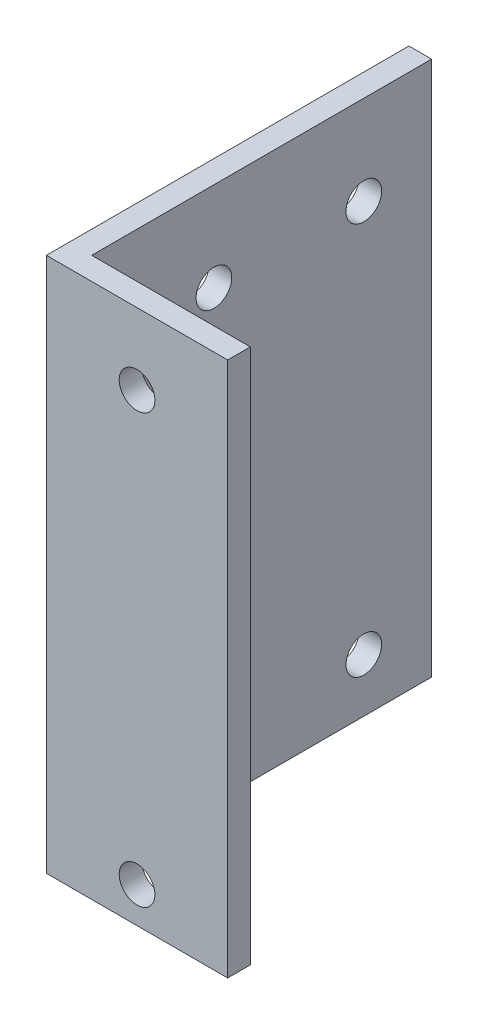
ISO-10303-21;
HEADER;
FILE_DESCRIPTION(('STEP AP214'),'2;1');
FILE_NAME('part.step','',(''),(''),'','','');
FILE_SCHEMA(('AUTOMOTIVE_DESIGN { 1 0 10303 214 1 1 1 1 }'));
ENDSEC;
DATA;
#1=APPLICATION_CONTEXT('core data for automotive mechanical design processes');
#2=APPLICATION_PROTOCOL_DEFINITION('international standard','automotive_design',2000,#1);
#3=PRODUCT_CONTEXT('',#1,'mechanical');
#4=PRODUCT('Part','Part','',(#3));
#5=PRODUCT_RELATED_PRODUCT_CATEGORY('part','',(#4));
#6=PRODUCT_DEFINITION_FORMATION('','',#4);
#7=PRODUCT_DEFINITION_CONTEXT('part definition',#1,'design');
#8=PRODUCT_DEFINITION('design','',#6,#7);
#9=PRODUCT_DEFINITION_SHAPE('','',#8);
#10=(LENGTH_UNIT() NAMED_UNIT(*) SI_UNIT(.MILLI.,.METRE.));
#11=(NAMED_UNIT(*) PLANE_ANGLE_UNIT() SI_UNIT($,.RADIAN.));
#12=(NAMED_UNIT(*) SI_UNIT($,.STERADIAN.) SOLID_ANGLE_UNIT());
#13=UNCERTAINTY_MEASURE_WITH_UNIT(LENGTH_MEASURE(1.E-05),#10,'distance_accuracy_value','');
#14=(GEOMETRIC_REPRESENTATION_CONTEXT(3) GLOBAL_UNCERTAINTY_ASSIGNED_CONTEXT((#13)) GLOBAL_UNIT_ASSIGNED_CONTEXT((#10,
#11,#12)) REPRESENTATION_CONTEXT('',''));
#15=CARTESIAN_POINT('',(0.,0.,0.));
#16=DIRECTION('',(0.,0.,1.));
#17=DIRECTION('',(1.,0.,0.));
#18=AXIS2_PLACEMENT_3D('',#15,#16,#17);
#19=CARTESIAN_POINT('',(25.4,80.,-3.175));
#20=DIRECTION('',(-1.,0.,0.));
#21=DIRECTION('',(0.,0.,1.));
#22=AXIS2_PLACEMENT_3D('',#19,#20,#21);
#23=PLANE('',#22);
#24=DIRECTION('',(0.,-1.,0.));
#25=VECTOR('',#24,1.);
#26=CARTESIAN_POINT('',(25.4,80.,0.));
#27=LINE('',#26,#25);
#28=CARTESIAN_POINT('',(25.4,80.,0.));
#29=VERTEX_POINT('',#28);
#30=CARTESIAN_POINT('',(25.4,5.,0.));
#31=VERTEX_POINT('',#30);
#32=EDGE_CURVE('E113',#29,#31,#27,.T.);
#33=ORIENTED_EDGE('',*,*,#32,.T.);
#34=DIRECTION('',(0.,0.,-1.));
#35=VECTOR('',#34,1.);
#36=CARTESIAN_POINT('',(25.4,5.,-3.175));
#37=LINE('',#36,#35);
#38=CARTESIAN_POINT('',(25.4,5.,-3.175));
#39=VERTEX_POINT('',#38);
#40=EDGE_CURVE('E56',#31,#39,#37,.T.);
#41=ORIENTED_EDGE('',*,*,#40,.T.);
#42=DIRECTION('',(0.,-1.,0.));
#43=VECTOR('',#42,1.);
#44=CARTESIAN_POINT('',(25.4,80.,-3.175));
#45=LINE('',#44,#43);
#46=CARTESIAN_POINT('',(25.4,80.,-3.175));
#47=VERTEX_POINT('',#46);
#48=EDGE_CURVE('E11',#47,#39,#45,.T.);
#49=ORIENTED_EDGE('',*,*,#48,.F.);
#50=DIRECTION('',(0.,0.,-1.));
#51=VECTOR('',#50,1.);
#52=CARTESIAN_POINT('',(25.4,80.,-3.175));
#53=LINE('',#52,#51);
#54=EDGE_CURVE('E175',#29,#47,#53,.T.);
#55=ORIENTED_EDGE('',*,*,#54,.F.);
#56=EDGE_LOOP('',(#33,#41,#49,#55));
#57=FACE_BOUND('',#56,.T.);
#58=ADVANCED_FACE('F42',(#57),#23,.F.);
#59=CARTESIAN_POINT('',(3.175,80.,-3.175));
#60=DIRECTION('',(0.,0.,1.));
#61=DIRECTION('',(1.,0.,0.));
#62=AXIS2_PLACEMENT_3D('',#59,#60,#61);
#63=PLANE('',#62);
#64=CARTESIAN_POINT('',(12.7,70.,-3.175));
#65=DIRECTION('',(0.,0.,1.));
#66=DIRECTION('',(1.,0.,0.));
#67=AXIS2_PLACEMENT_3D('',#64,#65,#66);
#68=CIRCLE('',#67,2.5);
#69=CARTESIAN_POINT('',(15.2,70.,-3.175));
#70=VERTEX_POINT('',#69);
#71=EDGE_CURVE('E148',#70,#70,#68,.T.);
#72=ORIENTED_EDGE('',*,*,#71,.T.);
#73=EDGE_LOOP('',(#72));
#74=FACE_BOUND('',#73,.T.);
#75=CARTESIAN_POINT('',(12.7,9.99999999999999,-3.175));
#76=DIRECTION('',(0.,0.,1.));
#77=DIRECTION('',(1.,0.,0.));
#78=AXIS2_PLACEMENT_3D('',#75,#76,#77);
#79=CIRCLE('',#78,2.5);
#80=CARTESIAN_POINT('',(15.2,9.99999999999999,-3.175));
#81=VERTEX_POINT('',#80);
#82=EDGE_CURVE('E143',#81,#81,#79,.T.);
#83=ORIENTED_EDGE('',*,*,#82,.T.);
#84=EDGE_LOOP('',(#83));
#85=FACE_BOUND('',#84,.T.);
#86=ORIENTED_EDGE('',*,*,#48,.T.);
#87=DIRECTION('',(-1.,0.,0.));
#88=VECTOR('',#87,1.);
#89=CARTESIAN_POINT('',(3.175,5.,-3.175));
#90=LINE('',#89,#88);
#91=CARTESIAN_POINT('',(3.175,5.,-3.175));
#92=VERTEX_POINT('',#91);
#93=EDGE_CURVE('E133',#39,#92,#90,.T.);
#94=ORIENTED_EDGE('',*,*,#93,.T.);
#95=DIRECTION('',(0.,-1.,0.));
#96=VECTOR('',#95,1.);
#97=CARTESIAN_POINT('',(3.175,80.,-3.175));
#98=LINE('',#97,#96);
#99=CARTESIAN_POINT('',(3.175,80.,-3.175));
#100=VERTEX_POINT('',#99);
#101=EDGE_CURVE('E49',#100,#92,#98,.T.);
#102=ORIENTED_EDGE('',*,*,#101,.F.);
#103=DIRECTION('',(-1.,0.,0.));
#104=VECTOR('',#103,1.);
#105=CARTESIAN_POINT('',(3.175,80.,-3.175));
#106=LINE('',#105,#104);
#107=EDGE_CURVE('E132',#47,#100,#106,.T.);
#108=ORIENTED_EDGE('',*,*,#107,.F.);
#109=EDGE_LOOP('',(#86,#94,#102,#108));
#110=FACE_BOUND('',#109,.T.);
#111=ADVANCED_FACE('F131',(#74,#85,#110),#63,.F.);
#112=CARTESIAN_POINT('',(3.175,80.,-50.8));
#113=DIRECTION('',(-1.,0.,0.));
#114=DIRECTION('',(0.,0.,1.));
#115=AXIS2_PLACEMENT_3D('',#112,#113,#114);
#116=PLANE('',#115);
#117=CARTESIAN_POINT('',(3.175,12.5,-41.3));
#118=DIRECTION('',(-1.,0.,0.));
#119=DIRECTION('',(0.,0.,1.));
#120=AXIS2_PLACEMENT_3D('',#117,#118,#119);
#121=CIRCLE('',#120,2.5);
#122=CARTESIAN_POINT('',(3.175,12.5,-38.8));
#123=VERTEX_POINT('',#122);
#124=EDGE_CURVE('E172',#123,#123,#121,.T.);
#125=ORIENTED_EDGE('',*,*,#124,.T.);
#126=EDGE_LOOP('',(#125));
#127=FACE_BOUND('',#126,.T.);
#128=CARTESIAN_POINT('',(3.175,12.5,-20.3));
#129=DIRECTION('',(-1.,0.,0.));
#130=DIRECTION('',(0.,0.,1.));
#131=AXIS2_PLACEMENT_3D('',#128,#129,#130);
#132=CIRCLE('',#131,2.5);
#133=CARTESIAN_POINT('',(3.175,12.5,-17.8));
#134=VERTEX_POINT('',#133);
#135=EDGE_CURVE('E169',#134,#134,#132,.T.);
#136=ORIENTED_EDGE('',*,*,#135,.T.);
#137=EDGE_LOOP('',(#136));
#138=FACE_BOUND('',#137,.T.);
#139=CARTESIAN_POINT('',(3.175,67.5,-20.3));
#140=DIRECTION('',(-1.,0.,0.));
#141=DIRECTION('',(0.,0.,1.));
#142=AXIS2_PLACEMENT_3D('',#139,#140,#141);
#143=CIRCLE('',#142,2.5);
#144=CARTESIAN_POINT('',(3.175,67.5,-17.8));
#145=VERTEX_POINT('',#144);
#146=EDGE_CURVE('E166',#145,#145,#143,.T.);
#147=ORIENTED_EDGE('',*,*,#146,.T.);
#148=EDGE_LOOP('',(#147));
#149=FACE_BOUND('',#148,.T.);
#150=CARTESIAN_POINT('',(3.175,67.5,-41.3));
#151=DIRECTION('',(-1.,0.,0.));
#152=DIRECTION('',(0.,0.,1.));
#153=AXIS2_PLACEMENT_3D('',#150,#151,#152);
#154=CIRCLE('',#153,2.5);
#155=CARTESIAN_POINT('',(3.175,67.5,-38.8));
#156=VERTEX_POINT('',#155);
#157=EDGE_CURVE('E163',#156,#156,#154,.T.);
#158=ORIENTED_EDGE('',*,*,#157,.T.);
#159=EDGE_LOOP('',(#158));
#160=FACE_BOUND('',#159,.T.);
#161=ORIENTED_EDGE('',*,*,#101,.T.);
#162=DIRECTION('',(0.,0.,-1.));
#163=VECTOR('',#162,1.);
#164=CARTESIAN_POINT('',(3.175,5.,-50.8));
#165=LINE('',#164,#163);
#166=CARTESIAN_POINT('',(3.175,5.,-50.8));
#167=VERTEX_POINT('',#166);
#168=EDGE_CURVE('E110',#92,#167,#165,.T.);
#169=ORIENTED_EDGE('',*,*,#168,.T.);
#170=DIRECTION('',(0.,-1.,0.));
#171=VECTOR('',#170,1.);
#172=CARTESIAN_POINT('',(3.175,80.,-50.8));
#173=LINE('',#172,#171);
#174=CARTESIAN_POINT('',(3.175,80.,-50.8));
#175=VERTEX_POINT('',#174);
#176=EDGE_CURVE('E115',#175,#167,#173,.T.);
#177=ORIENTED_EDGE('',*,*,#176,.F.);
#178=DIRECTION('',(0.,0.,-1.));
#179=VECTOR('',#178,1.);
#180=CARTESIAN_POINT('',(3.175,80.,-50.8));
#181=LINE('',#180,#179);
#182=EDGE_CURVE('E128',#100,#175,#181,.T.);
#183=ORIENTED_EDGE('',*,*,#182,.F.);
#184=EDGE_LOOP('',(#161,#169,#177,#183));
#185=FACE_BOUND('',#184,.T.);
#186=ADVANCED_FACE('F126',(#127,#138,#149,#160,#185),#116,.F.);
#187=CARTESIAN_POINT('',(0.,80.,-50.8));
#188=DIRECTION('',(0.,0.,1.));
#189=DIRECTION('',(1.,0.,0.));
#190=AXIS2_PLACEMENT_3D('',#187,#188,#189);
#191=PLANE('',#190);
#192=ORIENTED_EDGE('',*,*,#176,.T.);
#193=DIRECTION('',(-1.,0.,0.));
#194=VECTOR('',#193,1.);
#195=CARTESIAN_POINT('',(-2.3,5.,-50.8));
#196=LINE('',#195,#194);
#197=CARTESIAN_POINT('',(0.,5.,-50.8));
#198=VERTEX_POINT('',#197);
#199=EDGE_CURVE('E100',#167,#198,#196,.T.);
#200=ORIENTED_EDGE('',*,*,#199,.T.);
#201=DIRECTION('',(0.,-1.,0.));
#202=VECTOR('',#201,1.);
#203=CARTESIAN_POINT('',(0.,80.,-50.8));
#204=LINE('',#203,#202);
#205=CARTESIAN_POINT('',(0.,80.,-50.8));
#206=VERTEX_POINT('',#205);
#207=EDGE_CURVE('E109',#206,#198,#204,.T.);
#208=ORIENTED_EDGE('',*,*,#207,.F.);
#209=DIRECTION('',(-1.,0.,0.));
#210=VECTOR('',#209,1.);
#211=CARTESIAN_POINT('',(0.,80.,-50.8));
#212=LINE('',#211,#210);
#213=EDGE_CURVE('E179',#175,#206,#212,.T.);
#214=ORIENTED_EDGE('',*,*,#213,.F.);
#215=EDGE_LOOP('',(#192,#200,#208,#214));
#216=FACE_BOUND('',#215,.T.);
#217=ADVANCED_FACE('F185',(#216),#191,.F.);
#218=CARTESIAN_POINT('',(0.,80.,0.));
#219=DIRECTION('',(1.,0.,0.));
#220=DIRECTION('',(0.,0.,-1.));
#221=AXIS2_PLACEMENT_3D('',#218,#219,#220);
#222=PLANE('',#221);
#223=CARTESIAN_POINT('',(0.,12.5,-41.3));
#224=DIRECTION('',(-1.,0.,0.));
#225=DIRECTION('',(0.,0.,-1.));
#226=AXIS2_PLACEMENT_3D('',#223,#224,#225);
#227=CIRCLE('',#226,2.5);
#228=CARTESIAN_POINT('',(0.,12.5,-43.8));
#229=VERTEX_POINT('',#228);
#230=EDGE_CURVE('E151',#229,#229,#227,.T.);
#231=ORIENTED_EDGE('',*,*,#230,.F.);
#232=EDGE_LOOP('',(#231));
#233=FACE_BOUND('',#232,.T.);
#234=CARTESIAN_POINT('',(0.,12.5,-20.3));
#235=DIRECTION('',(-1.,0.,0.));
#236=DIRECTION('',(0.,0.,1.));
#237=AXIS2_PLACEMENT_3D('',#234,#235,#236);
#238=CIRCLE('',#237,2.5);
#239=CARTESIAN_POINT('',(0.,12.5,-17.8));
#240=VERTEX_POINT('',#239);
#241=EDGE_CURVE('E156',#240,#240,#238,.T.);
#242=ORIENTED_EDGE('',*,*,#241,.F.);
#243=EDGE_LOOP('',(#242));
#244=FACE_BOUND('',#243,.T.);
#245=CARTESIAN_POINT('',(0.,67.5,-20.3));
#246=DIRECTION('',(-1.,0.,0.));
#247=DIRECTION('',(0.,0.,-1.));
#248=AXIS2_PLACEMENT_3D('',#245,#246,#247);
#249=CIRCLE('',#248,2.5);
#250=CARTESIAN_POINT('',(0.,67.5,-22.8));
#251=VERTEX_POINT('',#250);
#252=EDGE_CURVE('E152',#251,#251,#249,.T.);
#253=ORIENTED_EDGE('',*,*,#252,.F.);
#254=EDGE_LOOP('',(#253));
#255=FACE_BOUND('',#254,.T.);
#256=CARTESIAN_POINT('',(0.,67.5,-41.3));
#257=DIRECTION('',(-1.,0.,0.));
#258=DIRECTION('',(0.,0.,1.));
#259=AXIS2_PLACEMENT_3D('',#256,#257,#258);
#260=CIRCLE('',#259,2.5);
#261=CARTESIAN_POINT('',(0.,67.5,-38.8));
#262=VERTEX_POINT('',#261);
#263=EDGE_CURVE('E155',#262,#262,#260,.T.);
#264=ORIENTED_EDGE('',*,*,#263,.F.);
#265=EDGE_LOOP('',(#264));
#266=FACE_BOUND('',#265,.T.);
#267=ORIENTED_EDGE('',*,*,#207,.T.);
#268=DIRECTION('',(0.,0.,1.));
#269=VECTOR('',#268,1.);
#270=CARTESIAN_POINT('',(0.,5.,0.));
#271=LINE('',#270,#269);
#272=CARTESIAN_POINT('',(0.,5.,0.));
#273=VERTEX_POINT('',#272);
#274=EDGE_CURVE('E95',#198,#273,#271,.T.);
#275=ORIENTED_EDGE('',*,*,#274,.T.);
#276=DIRECTION('',(0.,-1.,0.));
#277=VECTOR('',#276,1.);
#278=CARTESIAN_POINT('',(0.,80.,0.));
#279=LINE('',#278,#277);
#280=CARTESIAN_POINT('',(0.,80.,0.));
#281=VERTEX_POINT('',#280);
#282=EDGE_CURVE('E107',#281,#273,#279,.T.);
#283=ORIENTED_EDGE('',*,*,#282,.F.);
#284=DIRECTION('',(0.,0.,1.));
#285=VECTOR('',#284,1.);
#286=CARTESIAN_POINT('',(0.,80.,0.));
#287=LINE('',#286,#285);
#288=EDGE_CURVE('E181',#206,#281,#287,.T.);
#289=ORIENTED_EDGE('',*,*,#288,.F.);
#290=EDGE_LOOP('',(#267,#275,#283,#289));
#291=FACE_BOUND('',#290,.T.);
#292=ADVANCED_FACE('F105',(#233,#244,#255,#266,#291),#222,.F.);
#293=CARTESIAN_POINT('',(25.4,80.,0.));
#294=DIRECTION('',(0.,0.,-1.));
#295=DIRECTION('',(-1.,0.,0.));
#296=AXIS2_PLACEMENT_3D('',#293,#294,#295);
#297=PLANE('',#296);
#298=CARTESIAN_POINT('',(12.7,70.,0.));
#299=DIRECTION('',(0.,0.,1.));
#300=DIRECTION('',(1.,0.,0.));
#301=AXIS2_PLACEMENT_3D('',#298,#299,#300);
#302=CIRCLE('',#301,2.5);
#303=CARTESIAN_POINT('',(15.2,70.,0.));
#304=VERTEX_POINT('',#303);
#305=EDGE_CURVE('E140',#304,#304,#302,.T.);
#306=ORIENTED_EDGE('',*,*,#305,.F.);
#307=EDGE_LOOP('',(#306));
#308=FACE_BOUND('',#307,.T.);
#309=CARTESIAN_POINT('',(12.7,9.99999999999999,0.));
#310=DIRECTION('',(0.,0.,1.));
#311=DIRECTION('',(-1.,0.,0.));
#312=AXIS2_PLACEMENT_3D('',#309,#310,#311);
#313=CIRCLE('',#312,2.5);
#314=CARTESIAN_POINT('',(10.2,9.99999999999999,0.));
#315=VERTEX_POINT('',#314);
#316=EDGE_CURVE('E136',#315,#315,#313,.T.);
#317=ORIENTED_EDGE('',*,*,#316,.F.);
#318=EDGE_LOOP('',(#317));
#319=FACE_BOUND('',#318,.T.);
#320=ORIENTED_EDGE('',*,*,#282,.T.);
#321=DIRECTION('',(-1.,0.,0.));
#322=VECTOR('',#321,1.);
#323=CARTESIAN_POINT('',(-2.3,5.,0.));
#324=LINE('',#323,#322);
#325=EDGE_CURVE('E92',#31,#273,#324,.T.);
#326=ORIENTED_EDGE('',*,*,#325,.F.);
#327=ORIENTED_EDGE('',*,*,#32,.F.);
#328=DIRECTION('',(1.,0.,0.));
#329=VECTOR('',#328,1.);
#330=CARTESIAN_POINT('',(25.4,80.,0.));
#331=LINE('',#330,#329);
#332=EDGE_CURVE('E64',#281,#29,#331,.T.);
#333=ORIENTED_EDGE('',*,*,#332,.F.);
#334=EDGE_LOOP('',(#320,#326,#327,#333));
#335=FACE_BOUND('',#334,.T.);
#336=ADVANCED_FACE('F112',(#308,#319,#335),#297,.F.);
#337=CARTESIAN_POINT('',(0.,80.,0.));
#338=DIRECTION('',(0.,-1.,0.));
#339=DIRECTION('',(0.,0.,-1.));
#340=AXIS2_PLACEMENT_3D('',#337,#338,#339);
#341=PLANE('',#340);
#342=ORIENTED_EDGE('',*,*,#54,.T.);
#343=ORIENTED_EDGE('',*,*,#107,.T.);
#344=ORIENTED_EDGE('',*,*,#182,.T.);
#345=ORIENTED_EDGE('',*,*,#213,.T.);
#346=ORIENTED_EDGE('',*,*,#288,.T.);
#347=ORIENTED_EDGE('',*,*,#332,.T.);
#348=EDGE_LOOP('',(#342,#343,#344,#345,#346,#347));
#349=FACE_BOUND('',#348,.T.);
#350=ADVANCED_FACE('F182',(#349),#341,.F.);
#351=CARTESIAN_POINT('',(25.4,67.5,-41.3));
#352=DIRECTION('',(-1.,0.,0.));
#353=DIRECTION('',(0.,0.,1.));
#354=AXIS2_PLACEMENT_3D('',#351,#352,#353);
#355=CYLINDRICAL_SURFACE('',#354,2.5);
#356=ORIENTED_EDGE('',*,*,#263,.T.);
#357=EDGE_LOOP('',(#356));
#358=FACE_BOUND('',#357,.T.);
#359=ORIENTED_EDGE('',*,*,#157,.F.);
#360=EDGE_LOOP('',(#359));
#361=FACE_BOUND('',#360,.T.);
#362=ADVANCED_FACE('F230',(#358,#361),#355,.F.);
#363=CARTESIAN_POINT('',(25.4,67.5,-20.3));
#364=DIRECTION('',(-1.,0.,0.));
#365=DIRECTION('',(0.,0.,1.));
#366=AXIS2_PLACEMENT_3D('',#363,#364,#365);
#367=CYLINDRICAL_SURFACE('',#366,2.5);
#368=ORIENTED_EDGE('',*,*,#252,.T.);
#369=EDGE_LOOP('',(#368));
#370=FACE_BOUND('',#369,.T.);
#371=ORIENTED_EDGE('',*,*,#146,.F.);
#372=EDGE_LOOP('',(#371));
#373=FACE_BOUND('',#372,.T.);
#374=ADVANCED_FACE('F227',(#370,#373),#367,.F.);
#375=CARTESIAN_POINT('',(25.4,12.5,-20.3));
#376=DIRECTION('',(-1.,0.,0.));
#377=DIRECTION('',(0.,0.,1.));
#378=AXIS2_PLACEMENT_3D('',#375,#376,#377);
#379=CYLINDRICAL_SURFACE('',#378,2.5);
#380=ORIENTED_EDGE('',*,*,#241,.T.);
#381=EDGE_LOOP('',(#380));
#382=FACE_BOUND('',#381,.T.);
#383=ORIENTED_EDGE('',*,*,#135,.F.);
#384=EDGE_LOOP('',(#383));
#385=FACE_BOUND('',#384,.T.);
#386=ADVANCED_FACE('F222',(#382,#385),#379,.F.);
#387=CARTESIAN_POINT('',(25.4,12.5,-41.3));
#388=DIRECTION('',(-1.,0.,0.));
#389=DIRECTION('',(0.,0.,1.));
#390=AXIS2_PLACEMENT_3D('',#387,#388,#389);
#391=CYLINDRICAL_SURFACE('',#390,2.5);
#392=ORIENTED_EDGE('',*,*,#230,.T.);
#393=EDGE_LOOP('',(#392));
#394=FACE_BOUND('',#393,.T.);
#395=ORIENTED_EDGE('',*,*,#124,.F.);
#396=EDGE_LOOP('',(#395));
#397=FACE_BOUND('',#396,.T.);
#398=ADVANCED_FACE('F213',(#394,#397),#391,.F.);
#399=CARTESIAN_POINT('',(12.7,9.99999999999999,-50.8));
#400=DIRECTION('',(0.,0.,1.));
#401=DIRECTION('',(1.,0.,0.));
#402=AXIS2_PLACEMENT_3D('',#399,#400,#401);
#403=CYLINDRICAL_SURFACE('',#402,2.5);
#404=ORIENTED_EDGE('',*,*,#316,.T.);
#405=EDGE_LOOP('',(#404));
#406=FACE_BOUND('',#405,.T.);
#407=ORIENTED_EDGE('',*,*,#82,.F.);
#408=EDGE_LOOP('',(#407));
#409=FACE_BOUND('',#408,.T.);
#410=ADVANCED_FACE('F210',(#406,#409),#403,.F.);
#411=CARTESIAN_POINT('',(12.7,70.,-50.8));
#412=DIRECTION('',(0.,0.,1.));
#413=DIRECTION('',(1.,0.,0.));
#414=AXIS2_PLACEMENT_3D('',#411,#412,#413);
#415=CYLINDRICAL_SURFACE('',#414,2.5);
#416=ORIENTED_EDGE('',*,*,#305,.T.);
#417=EDGE_LOOP('',(#416));
#418=FACE_BOUND('',#417,.T.);
#419=ORIENTED_EDGE('',*,*,#71,.F.);
#420=EDGE_LOOP('',(#419));
#421=FACE_BOUND('',#420,.T.);
#422=ADVANCED_FACE('F212',(#418,#421),#415,.F.);
#423=CARTESIAN_POINT('',(-2.3,5.,-50.8));
#424=DIRECTION('',(0.,1.,0.));
#425=DIRECTION('',(0.,0.,1.));
#426=AXIS2_PLACEMENT_3D('',#423,#424,#425);
#427=PLANE('',#426);
#428=ORIENTED_EDGE('',*,*,#325,.T.);
#429=ORIENTED_EDGE('',*,*,#274,.F.);
#430=ORIENTED_EDGE('',*,*,#199,.F.);
#431=ORIENTED_EDGE('',*,*,#168,.F.);
#432=ORIENTED_EDGE('',*,*,#93,.F.);
#433=ORIENTED_EDGE('',*,*,#40,.F.);
#434=EDGE_LOOP('',(#428,#429,#430,#431,#432,#433));
#435=FACE_BOUND('',#434,.T.);
#436=ADVANCED_FACE('F94',(#435),#427,.F.);
#437=CLOSED_SHELL('',(#58,#111,#186,#217,#292,#336,#350,#362,#374,#386,#398,#410,#422,#436));
#438=MANIFOLD_SOLID_BREP('B2',#437);
#439=ADVANCED_BREP_SHAPE_REPRESENTATION('',(#18,#438),#14);
#440=SHAPE_DEFINITION_REPRESENTATION(#9,#439);
ENDSEC;
END-ISO-10303-21;
